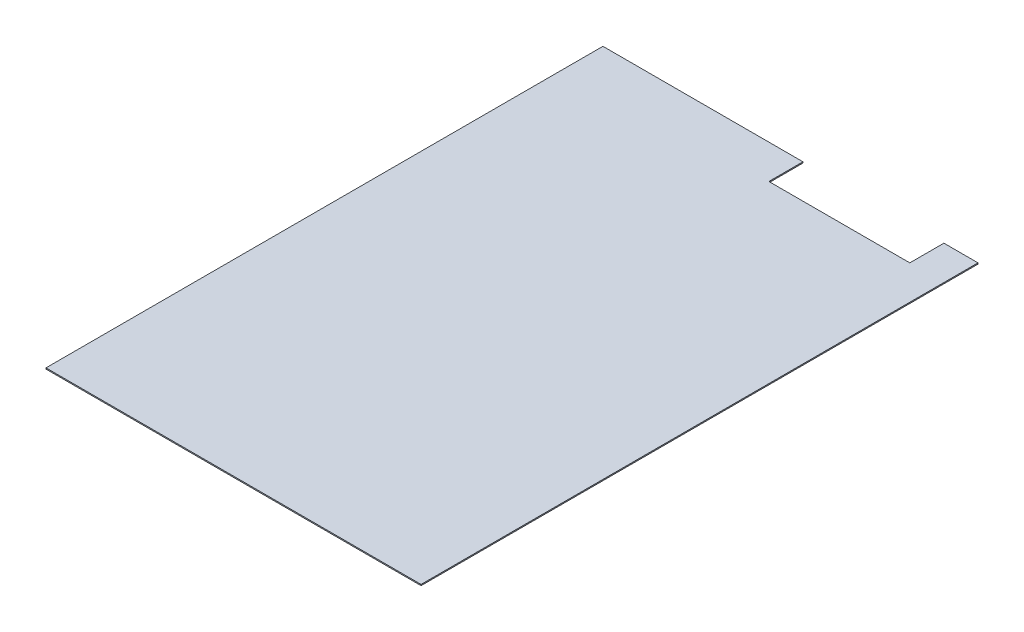
ISO-10303-21;
HEADER;
FILE_DESCRIPTION(('STEP AP214'),'2;1');
FILE_NAME('part.step','',(''),(''),'','','');
FILE_SCHEMA(('AUTOMOTIVE_DESIGN { 1 0 10303 214 1 1 1 1 }'));
ENDSEC;
DATA;
#1=APPLICATION_CONTEXT('core data for automotive mechanical design processes');
#2=APPLICATION_PROTOCOL_DEFINITION('international standard','automotive_design',2000,#1);
#3=PRODUCT_CONTEXT('',#1,'mechanical');
#4=PRODUCT('Part','Part','',(#3));
#5=PRODUCT_RELATED_PRODUCT_CATEGORY('part','',(#4));
#6=PRODUCT_DEFINITION_FORMATION('','',#4);
#7=PRODUCT_DEFINITION_CONTEXT('part definition',#1,'design');
#8=PRODUCT_DEFINITION('design','',#6,#7);
#9=PRODUCT_DEFINITION_SHAPE('','',#8);
#10=(LENGTH_UNIT() NAMED_UNIT(*) SI_UNIT(.MILLI.,.METRE.));
#11=(NAMED_UNIT(*) PLANE_ANGLE_UNIT() SI_UNIT($,.RADIAN.));
#12=(NAMED_UNIT(*) SI_UNIT($,.STERADIAN.) SOLID_ANGLE_UNIT());
#13=UNCERTAINTY_MEASURE_WITH_UNIT(LENGTH_MEASURE(1.E-05),#10,'distance_accuracy_value','');
#14=(GEOMETRIC_REPRESENTATION_CONTEXT(3) GLOBAL_UNCERTAINTY_ASSIGNED_CONTEXT((#13)) GLOBAL_UNIT_ASSIGNED_CONTEXT((#10,
#11,#12)) REPRESENTATION_CONTEXT('',''));
#15=CARTESIAN_POINT('',(0.,0.,0.));
#16=DIRECTION('',(0.,0.,1.));
#17=DIRECTION('',(1.,0.,0.));
#18=AXIS2_PLACEMENT_3D('',#15,#16,#17);
#19=CARTESIAN_POINT('',(-82.5,0.5,-122.5));
#20=DIRECTION('',(0.,0.,1.));
#21=DIRECTION('',(1.,0.,0.));
#22=AXIS2_PLACEMENT_3D('',#19,#20,#21);
#23=PLANE('',#22);
#24=DIRECTION('',(-1.,0.,0.));
#25=VECTOR('',#24,1.);
#26=CARTESIAN_POINT('',(-82.5,0.5,-122.5));
#27=LINE('',#26,#25);
#28=CARTESIAN_POINT('',(5.49999999999999,0.5,-122.5));
#29=VERTEX_POINT('',#28);
#30=CARTESIAN_POINT('',(-82.5,0.5,-122.5));
#31=VERTEX_POINT('',#30);
#32=EDGE_CURVE('E150',#29,#31,#27,.T.);
#33=ORIENTED_EDGE('',*,*,#32,.F.);
#34=DIRECTION('',(0.,-1.,0.));
#35=VECTOR('',#34,1.);
#36=CARTESIAN_POINT('',(5.49999999999999,10.,-122.5));
#37=LINE('',#36,#35);
#38=CARTESIAN_POINT('',(5.49999999999999,0.,-122.5));
#39=VERTEX_POINT('',#38);
#40=EDGE_CURVE('E137',#29,#39,#37,.T.);
#41=ORIENTED_EDGE('',*,*,#40,.T.);
#42=DIRECTION('',(-1.,0.,0.));
#43=VECTOR('',#42,1.);
#44=CARTESIAN_POINT('',(-82.5,0.,-122.5));
#45=LINE('',#44,#43);
#46=CARTESIAN_POINT('',(-82.5,0.,-122.5));
#47=VERTEX_POINT('',#46);
#48=EDGE_CURVE('E158',#39,#47,#45,.T.);
#49=ORIENTED_EDGE('',*,*,#48,.T.);
#50=DIRECTION('',(0.,-1.,0.));
#51=VECTOR('',#50,1.);
#52=CARTESIAN_POINT('',(-82.5,0.5,-122.5));
#53=LINE('',#52,#51);
#54=EDGE_CURVE('E48',#31,#47,#53,.T.);
#55=ORIENTED_EDGE('',*,*,#54,.F.);
#56=EDGE_LOOP('',(#33,#41,#49,#55));
#57=FACE_BOUND('',#56,.T.);
#58=ADVANCED_FACE('F40',(#57),#23,.F.);
#59=CARTESIAN_POINT('',(82.5,0.5,-122.5));
#60=DIRECTION('',(-1.,0.,0.));
#61=DIRECTION('',(0.,0.,1.));
#62=AXIS2_PLACEMENT_3D('',#59,#60,#61);
#63=PLANE('',#62);
#64=DIRECTION('',(0.,0.,-1.));
#65=VECTOR('',#64,1.);
#66=CARTESIAN_POINT('',(82.5,0.,-122.5));
#67=LINE('',#66,#65);
#68=CARTESIAN_POINT('',(82.5,0.,122.5));
#69=VERTEX_POINT('',#68);
#70=CARTESIAN_POINT('',(82.5,0.,-122.5));
#71=VERTEX_POINT('',#70);
#72=EDGE_CURVE('E147',#69,#71,#67,.T.);
#73=ORIENTED_EDGE('',*,*,#72,.T.);
#74=DIRECTION('',(0.,-1.,0.));
#75=VECTOR('',#74,1.);
#76=CARTESIAN_POINT('',(82.5,0.5,-122.5));
#77=LINE('',#76,#75);
#78=CARTESIAN_POINT('',(82.5,0.5,-122.5));
#79=VERTEX_POINT('',#78);
#80=EDGE_CURVE('E11',#79,#71,#77,.T.);
#81=ORIENTED_EDGE('',*,*,#80,.F.);
#82=DIRECTION('',(0.,0.,-1.));
#83=VECTOR('',#82,1.);
#84=CARTESIAN_POINT('',(82.5,0.5,-122.5));
#85=LINE('',#84,#83);
#86=CARTESIAN_POINT('',(82.5,0.5,122.5));
#87=VERTEX_POINT('',#86);
#88=EDGE_CURVE('E148',#87,#79,#85,.T.);
#89=ORIENTED_EDGE('',*,*,#88,.F.);
#90=DIRECTION('',(0.,-1.,0.));
#91=VECTOR('',#90,1.);
#92=CARTESIAN_POINT('',(82.5,0.5,122.5));
#93=LINE('',#92,#91);
#94=EDGE_CURVE('E155',#87,#69,#93,.T.);
#95=ORIENTED_EDGE('',*,*,#94,.T.);
#96=EDGE_LOOP('',(#73,#81,#89,#95));
#97=FACE_BOUND('',#96,.T.);
#98=ADVANCED_FACE('F42',(#97),#63,.F.);
#99=CARTESIAN_POINT('',(67.5,0.,-122.5));
#100=VERTEX_POINT('',#99);
#101=EDGE_CURVE('E159',#71,#100,#45,.T.);
#102=ORIENTED_EDGE('',*,*,#101,.T.);
#103=DIRECTION('',(0.,-1.,0.));
#104=VECTOR('',#103,1.);
#105=CARTESIAN_POINT('',(67.5,10.,-122.5));
#106=LINE('',#105,#104);
#107=CARTESIAN_POINT('',(67.5,0.5,-122.5));
#108=VERTEX_POINT('',#107);
#109=EDGE_CURVE('E55',#108,#100,#106,.T.);
#110=ORIENTED_EDGE('',*,*,#109,.F.);
#111=EDGE_CURVE('E91',#79,#108,#27,.T.);
#112=ORIENTED_EDGE('',*,*,#111,.F.);
#113=ORIENTED_EDGE('',*,*,#80,.T.);
#114=EDGE_LOOP('',(#102,#110,#112,#113));
#115=FACE_BOUND('',#114,.T.);
#116=ADVANCED_FACE('F188',(#115),#23,.F.);
#117=CARTESIAN_POINT('',(-82.5,0.5,-122.5));
#118=DIRECTION('',(1.,0.,0.));
#119=DIRECTION('',(0.,0.,-1.));
#120=AXIS2_PLACEMENT_3D('',#117,#118,#119);
#121=PLANE('',#120);
#122=DIRECTION('',(0.,0.,1.));
#123=VECTOR('',#122,1.);
#124=CARTESIAN_POINT('',(-82.5,0.,-122.5));
#125=LINE('',#124,#123);
#126=CARTESIAN_POINT('',(-82.5,0.,122.5));
#127=VERTEX_POINT('',#126);
#128=EDGE_CURVE('E161',#47,#127,#125,.T.);
#129=ORIENTED_EDGE('',*,*,#128,.T.);
#130=DIRECTION('',(0.,-1.,0.));
#131=VECTOR('',#130,1.);
#132=CARTESIAN_POINT('',(-82.5,0.5,122.5));
#133=LINE('',#132,#131);
#134=CARTESIAN_POINT('',(-82.5,0.5,122.5));
#135=VERTEX_POINT('',#134);
#136=EDGE_CURVE('E165',#135,#127,#133,.T.);
#137=ORIENTED_EDGE('',*,*,#136,.F.);
#138=DIRECTION('',(0.,0.,1.));
#139=VECTOR('',#138,1.);
#140=CARTESIAN_POINT('',(-82.5,0.5,-122.5));
#141=LINE('',#140,#139);
#142=EDGE_CURVE('E152',#31,#135,#141,.T.);
#143=ORIENTED_EDGE('',*,*,#142,.F.);
#144=ORIENTED_EDGE('',*,*,#54,.T.);
#145=EDGE_LOOP('',(#129,#137,#143,#144));
#146=FACE_BOUND('',#145,.T.);
#147=ADVANCED_FACE('F171',(#146),#121,.F.);
#148=CARTESIAN_POINT('',(-82.5,0.5,122.5));
#149=DIRECTION('',(0.,0.,-1.));
#150=DIRECTION('',(-1.,0.,0.));
#151=AXIS2_PLACEMENT_3D('',#148,#149,#150);
#152=PLANE('',#151);
#153=DIRECTION('',(1.,0.,0.));
#154=VECTOR('',#153,1.);
#155=CARTESIAN_POINT('',(-82.5,0.,122.5));
#156=LINE('',#155,#154);
#157=EDGE_CURVE('E85',#127,#69,#156,.T.);
#158=ORIENTED_EDGE('',*,*,#157,.T.);
#159=ORIENTED_EDGE('',*,*,#94,.F.);
#160=DIRECTION('',(1.,0.,0.));
#161=VECTOR('',#160,1.);
#162=CARTESIAN_POINT('',(-82.5,0.5,122.5));
#163=LINE('',#162,#161);
#164=EDGE_CURVE('E64',#135,#87,#163,.T.);
#165=ORIENTED_EDGE('',*,*,#164,.F.);
#166=ORIENTED_EDGE('',*,*,#136,.T.);
#167=EDGE_LOOP('',(#158,#159,#165,#166));
#168=FACE_BOUND('',#167,.T.);
#169=ADVANCED_FACE('F179',(#168),#152,.F.);
#170=CARTESIAN_POINT('',(0.,0.5,0.));
#171=DIRECTION('',(0.,1.,0.));
#172=DIRECTION('',(0.,0.,1.));
#173=AXIS2_PLACEMENT_3D('',#170,#171,#172);
#174=PLANE('',#173);
#175=DIRECTION('',(0.,0.,1.));
#176=VECTOR('',#175,1.);
#177=CARTESIAN_POINT('',(5.49999999999998,0.5,0.));
#178=LINE('',#177,#176);
#179=CARTESIAN_POINT('',(5.49999999999999,0.5,-107.5));
#180=VERTEX_POINT('',#179);
#181=EDGE_CURVE('E145',#29,#180,#178,.T.);
#182=ORIENTED_EDGE('',*,*,#181,.F.);
#183=ORIENTED_EDGE('',*,*,#32,.T.);
#184=ORIENTED_EDGE('',*,*,#142,.T.);
#185=ORIENTED_EDGE('',*,*,#164,.T.);
#186=ORIENTED_EDGE('',*,*,#88,.T.);
#187=ORIENTED_EDGE('',*,*,#111,.T.);
#188=DIRECTION('',(0.,0.,-1.));
#189=VECTOR('',#188,1.);
#190=CARTESIAN_POINT('',(67.5,0.5,0.));
#191=LINE('',#190,#189);
#192=CARTESIAN_POINT('',(67.5,0.5,-107.5));
#193=VERTEX_POINT('',#192);
#194=EDGE_CURVE('E140',#193,#108,#191,.T.);
#195=ORIENTED_EDGE('',*,*,#194,.F.);
#196=DIRECTION('',(1.,0.,0.));
#197=VECTOR('',#196,1.);
#198=CARTESIAN_POINT('',(0.,0.5,-107.5));
#199=LINE('',#198,#197);
#200=EDGE_CURVE('E122',#180,#193,#199,.T.);
#201=ORIENTED_EDGE('',*,*,#200,.F.);
#202=EDGE_LOOP('',(#182,#183,#184,#185,#186,#187,#195,#201));
#203=FACE_BOUND('',#202,.T.);
#204=ADVANCED_FACE('F181',(#203),#174,.T.);
#205=CARTESIAN_POINT('',(0.,0.,0.));
#206=DIRECTION('',(0.,1.,0.));
#207=DIRECTION('',(0.,0.,1.));
#208=AXIS2_PLACEMENT_3D('',#205,#206,#207);
#209=PLANE('',#208);
#210=ORIENTED_EDGE('',*,*,#48,.F.);
#211=DIRECTION('',(0.,0.,-1.));
#212=VECTOR('',#211,1.);
#213=CARTESIAN_POINT('',(5.49999999999999,0.,-107.5));
#214=LINE('',#213,#212);
#215=CARTESIAN_POINT('',(5.49999999999999,0.,-107.5));
#216=VERTEX_POINT('',#215);
#217=EDGE_CURVE('E133',#216,#39,#214,.T.);
#218=ORIENTED_EDGE('',*,*,#217,.F.);
#219=DIRECTION('',(-1.,0.,0.));
#220=VECTOR('',#219,1.);
#221=CARTESIAN_POINT('',(67.5,0.,-107.5));
#222=LINE('',#221,#220);
#223=CARTESIAN_POINT('',(67.5,0.,-107.5));
#224=VERTEX_POINT('',#223);
#225=EDGE_CURVE('E119',#224,#216,#222,.T.);
#226=ORIENTED_EDGE('',*,*,#225,.F.);
#227=DIRECTION('',(0.,0.,1.));
#228=VECTOR('',#227,1.);
#229=CARTESIAN_POINT('',(67.5,0.,-122.5));
#230=LINE('',#229,#228);
#231=EDGE_CURVE('E126',#100,#224,#230,.T.);
#232=ORIENTED_EDGE('',*,*,#231,.F.);
#233=ORIENTED_EDGE('',*,*,#101,.F.);
#234=ORIENTED_EDGE('',*,*,#72,.F.);
#235=ORIENTED_EDGE('',*,*,#157,.F.);
#236=ORIENTED_EDGE('',*,*,#128,.F.);
#237=EDGE_LOOP('',(#210,#218,#226,#232,#233,#234,#235,#236));
#238=FACE_BOUND('',#237,.T.);
#239=ADVANCED_FACE('F132',(#238),#209,.F.);
#240=CARTESIAN_POINT('',(5.49999999999999,10.,-107.5));
#241=DIRECTION('',(-1.,0.,0.));
#242=DIRECTION('',(0.,0.,1.));
#243=AXIS2_PLACEMENT_3D('',#240,#241,#242);
#244=PLANE('',#243);
#245=ORIENTED_EDGE('',*,*,#181,.T.);
#246=DIRECTION('',(0.,-1.,0.));
#247=VECTOR('',#246,1.);
#248=CARTESIAN_POINT('',(5.49999999999999,10.,-107.5));
#249=LINE('',#248,#247);
#250=EDGE_CURVE('E124',#180,#216,#249,.T.);
#251=ORIENTED_EDGE('',*,*,#250,.T.);
#252=ORIENTED_EDGE('',*,*,#217,.T.);
#253=ORIENTED_EDGE('',*,*,#40,.F.);
#254=EDGE_LOOP('',(#245,#251,#252,#253));
#255=FACE_BOUND('',#254,.T.);
#256=ADVANCED_FACE('F200',(#255),#244,.F.);
#257=CARTESIAN_POINT('',(67.5,10.,-107.5));
#258=DIRECTION('',(0.,0.,1.));
#259=DIRECTION('',(1.,0.,0.));
#260=AXIS2_PLACEMENT_3D('',#257,#258,#259);
#261=PLANE('',#260);
#262=ORIENTED_EDGE('',*,*,#200,.T.);
#263=DIRECTION('',(0.,-1.,0.));
#264=VECTOR('',#263,1.);
#265=CARTESIAN_POINT('',(67.5,10.,-107.5));
#266=LINE('',#265,#264);
#267=EDGE_CURVE('E115',#193,#224,#266,.T.);
#268=ORIENTED_EDGE('',*,*,#267,.T.);
#269=ORIENTED_EDGE('',*,*,#225,.T.);
#270=ORIENTED_EDGE('',*,*,#250,.F.);
#271=EDGE_LOOP('',(#262,#268,#269,#270));
#272=FACE_BOUND('',#271,.T.);
#273=ADVANCED_FACE('F116',(#272),#261,.F.);
#274=CARTESIAN_POINT('',(67.5,10.,-122.5));
#275=DIRECTION('',(1.,0.,0.));
#276=DIRECTION('',(0.,0.,-1.));
#277=AXIS2_PLACEMENT_3D('',#274,#275,#276);
#278=PLANE('',#277);
#279=ORIENTED_EDGE('',*,*,#194,.T.);
#280=ORIENTED_EDGE('',*,*,#109,.T.);
#281=ORIENTED_EDGE('',*,*,#231,.T.);
#282=ORIENTED_EDGE('',*,*,#267,.F.);
#283=EDGE_LOOP('',(#279,#280,#281,#282));
#284=FACE_BOUND('',#283,.T.);
#285=ADVANCED_FACE('F127',(#284),#278,.F.);
#286=CLOSED_SHELL('',(#58,#98,#116,#147,#169,#204,#239,#256,#273,#285));
#287=MANIFOLD_SOLID_BREP('B2',#286);
#288=ADVANCED_BREP_SHAPE_REPRESENTATION('',(#18,#287),#14);
#289=SHAPE_DEFINITION_REPRESENTATION(#9,#288);
ENDSEC;
END-ISO-10303-21;
